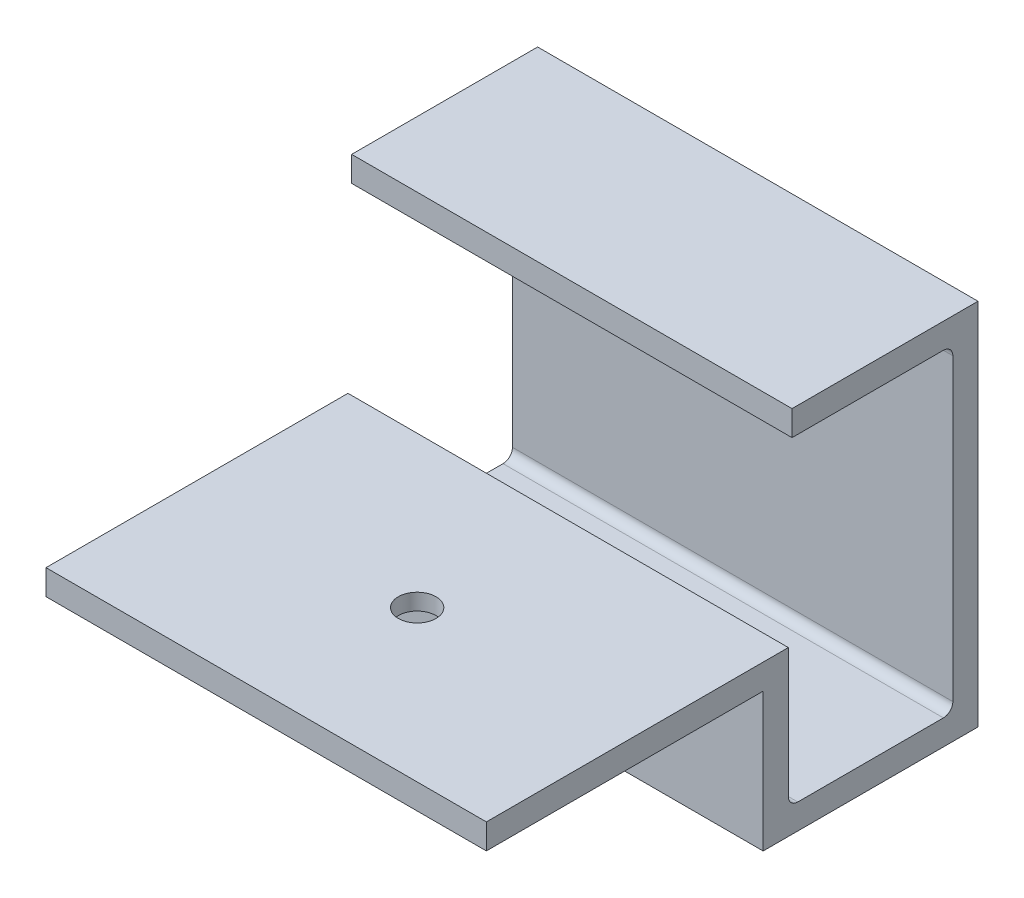
ISO-10303-21;
HEADER;
FILE_DESCRIPTION(('STEP AP214'),'2;1');
FILE_NAME('part.step','',(''),(''),'','','');
FILE_SCHEMA(('AUTOMOTIVE_DESIGN { 1 0 10303 214 1 1 1 1 }'));
ENDSEC;
DATA;
#1=APPLICATION_CONTEXT('core data for automotive mechanical design processes');
#2=APPLICATION_PROTOCOL_DEFINITION('international standard','automotive_design',2000,#1);
#3=PRODUCT_CONTEXT('',#1,'mechanical');
#4=PRODUCT('Part','Part','',(#3));
#5=PRODUCT_RELATED_PRODUCT_CATEGORY('part','',(#4));
#6=PRODUCT_DEFINITION_FORMATION('','',#4);
#7=PRODUCT_DEFINITION_CONTEXT('part definition',#1,'design');
#8=PRODUCT_DEFINITION('design','',#6,#7);
#9=PRODUCT_DEFINITION_SHAPE('','',#8);
#10=(LENGTH_UNIT() NAMED_UNIT(*) SI_UNIT(.MILLI.,.METRE.));
#11=(NAMED_UNIT(*) PLANE_ANGLE_UNIT() SI_UNIT($,.RADIAN.));
#12=(NAMED_UNIT(*) SI_UNIT($,.STERADIAN.) SOLID_ANGLE_UNIT());
#13=UNCERTAINTY_MEASURE_WITH_UNIT(LENGTH_MEASURE(1.E-05),#10,'distance_accuracy_value','');
#14=(GEOMETRIC_REPRESENTATION_CONTEXT(3) GLOBAL_UNCERTAINTY_ASSIGNED_CONTEXT((#13)) GLOBAL_UNIT_ASSIGNED_CONTEXT((#10,
#11,#12)) REPRESENTATION_CONTEXT('',''));
#15=CARTESIAN_POINT('',(0.,0.,0.));
#16=DIRECTION('',(0.,0.,1.));
#17=DIRECTION('',(1.,0.,0.));
#18=AXIS2_PLACEMENT_3D('',#15,#16,#17);
#19=CARTESIAN_POINT('',(70.,0.,-20.));
#20=DIRECTION('',(0.,0.,-1.));
#21=DIRECTION('',(0.,1.,0.));
#22=AXIS2_PLACEMENT_3D('',#19,#20,#21);
#23=PLANE('',#22);
#24=DIRECTION('',(0.,-1.,0.));
#25=VECTOR('',#24,1.);
#26=CARTESIAN_POINT('',(0.,0.,-20.));
#27=LINE('',#26,#25);
#28=CARTESIAN_POINT('',(0.,-2.,-20.));
#29=VERTEX_POINT('',#28);
#30=CARTESIAN_POINT('',(0.,-24.01,-20.));
#31=VERTEX_POINT('',#30);
#32=EDGE_CURVE('E290',#29,#31,#27,.T.);
#33=ORIENTED_EDGE('',*,*,#32,.T.);
#34=DIRECTION('',(-1.,0.,0.));
#35=VECTOR('',#34,1.);
#36=CARTESIAN_POINT('',(70.,-24.01,-20.));
#37=LINE('',#36,#35);
#38=CARTESIAN_POINT('',(70.,-24.01,-20.));
#39=VERTEX_POINT('',#38);
#40=EDGE_CURVE('E196',#39,#31,#37,.T.);
#41=ORIENTED_EDGE('',*,*,#40,.F.);
#42=DIRECTION('',(0.,-1.,0.));
#43=VECTOR('',#42,1.);
#44=CARTESIAN_POINT('',(70.,0.,-20.));
#45=LINE('',#44,#43);
#46=CARTESIAN_POINT('',(70.,-2.,-20.));
#47=VERTEX_POINT('',#46);
#48=EDGE_CURVE('E190',#47,#39,#45,.T.);
#49=ORIENTED_EDGE('',*,*,#48,.F.);
#50=DIRECTION('',(-1.,0.,0.));
#51=VECTOR('',#50,1.);
#52=CARTESIAN_POINT('',(70.,-2.,-20.));
#53=LINE('',#52,#51);
#54=EDGE_CURVE('E194',#47,#29,#53,.T.);
#55=ORIENTED_EDGE('',*,*,#54,.T.);
#56=EDGE_LOOP('',(#33,#41,#49,#55));
#57=FACE_BOUND('',#56,.T.);
#58=ADVANCED_FACE('F82',(#57),#23,.F.);
#59=CARTESIAN_POINT('',(70.,-24.01,0.));
#60=DIRECTION('',(0.,-1.,0.));
#61=DIRECTION('',(0.,0.,-1.));
#62=AXIS2_PLACEMENT_3D('',#59,#60,#61);
#63=PLANE('',#62);
#64=DIRECTION('',(0.,0.,1.));
#65=VECTOR('',#64,1.);
#66=CARTESIAN_POINT('',(0.,-24.01,0.));
#67=LINE('',#66,#65);
#68=CARTESIAN_POINT('',(0.,-24.01,-54.15));
#69=VERTEX_POINT('',#68);
#70=EDGE_CURVE('E292',#69,#31,#67,.T.);
#71=ORIENTED_EDGE('',*,*,#70,.F.);
#72=DIRECTION('',(-1.,0.,0.));
#73=VECTOR('',#72,1.);
#74=CARTESIAN_POINT('',(70.,-24.01,-54.15));
#75=LINE('',#74,#73);
#76=CARTESIAN_POINT('',(70.,-24.01,-54.15));
#77=VERTEX_POINT('',#76);
#78=EDGE_CURVE('E220',#77,#69,#75,.T.);
#79=ORIENTED_EDGE('',*,*,#78,.F.);
#80=DIRECTION('',(0.,0.,1.));
#81=VECTOR('',#80,1.);
#82=CARTESIAN_POINT('',(70.,-24.01,0.));
#83=LINE('',#82,#81);
#84=EDGE_CURVE('E199',#77,#39,#83,.T.);
#85=ORIENTED_EDGE('',*,*,#84,.T.);
#86=ORIENTED_EDGE('',*,*,#40,.T.);
#87=EDGE_LOOP('',(#71,#79,#85,#86));
#88=FACE_BOUND('',#87,.T.);
#89=ADVANCED_FACE('F321',(#88),#63,.T.);
#90=CARTESIAN_POINT('',(70.,0.,-54.15));
#91=DIRECTION('',(0.,0.,1.));
#92=DIRECTION('',(1.,0.,0.));
#93=AXIS2_PLACEMENT_3D('',#90,#91,#92);
#94=PLANE('',#93);
#95=DIRECTION('',(0.,1.,0.));
#96=VECTOR('',#95,1.);
#97=CARTESIAN_POINT('',(0.,0.,-54.15));
#98=LINE('',#97,#96);
#99=CARTESIAN_POINT('',(0.,34.6,-54.15));
#100=VERTEX_POINT('',#99);
#101=EDGE_CURVE('E295',#69,#100,#98,.T.);
#102=ORIENTED_EDGE('',*,*,#101,.T.);
#103=DIRECTION('',(-1.,0.,0.));
#104=VECTOR('',#103,1.);
#105=CARTESIAN_POINT('',(70.,34.6,-54.15));
#106=LINE('',#105,#104);
#107=CARTESIAN_POINT('',(70.,34.6,-54.15));
#108=VERTEX_POINT('',#107);
#109=EDGE_CURVE('E311',#108,#100,#106,.T.);
#110=ORIENTED_EDGE('',*,*,#109,.F.);
#111=DIRECTION('',(0.,1.,0.));
#112=VECTOR('',#111,1.);
#113=CARTESIAN_POINT('',(70.,0.,-54.15));
#114=LINE('',#113,#112);
#115=EDGE_CURVE('E317',#77,#108,#114,.T.);
#116=ORIENTED_EDGE('',*,*,#115,.F.);
#117=ORIENTED_EDGE('',*,*,#78,.T.);
#118=EDGE_LOOP('',(#102,#110,#116,#117));
#119=FACE_BOUND('',#118,.T.);
#120=ADVANCED_FACE('F315',(#119),#94,.F.);
#121=CARTESIAN_POINT('',(70.,34.6,0.));
#122=DIRECTION('',(0.,1.,0.));
#123=DIRECTION('',(0.,0.,1.));
#124=AXIS2_PLACEMENT_3D('',#121,#122,#123);
#125=PLANE('',#124);
#126=DIRECTION('',(0.,0.,-1.));
#127=VECTOR('',#126,1.);
#128=CARTESIAN_POINT('',(0.,34.6,0.));
#129=LINE('',#128,#127);
#130=CARTESIAN_POINT('',(0.,34.6,-24.59));
#131=VERTEX_POINT('',#130);
#132=EDGE_CURVE('E298',#131,#100,#129,.T.);
#133=ORIENTED_EDGE('',*,*,#132,.F.);
#134=DIRECTION('',(-1.,0.,0.));
#135=VECTOR('',#134,1.);
#136=CARTESIAN_POINT('',(70.,34.6,-24.59));
#137=LINE('',#136,#135);
#138=CARTESIAN_POINT('',(70.,34.6,-24.59));
#139=VERTEX_POINT('',#138);
#140=EDGE_CURVE('E236',#139,#131,#137,.T.);
#141=ORIENTED_EDGE('',*,*,#140,.F.);
#142=DIRECTION('',(0.,0.,-1.));
#143=VECTOR('',#142,1.);
#144=CARTESIAN_POINT('',(70.,34.6,0.));
#145=LINE('',#144,#143);
#146=EDGE_CURVE('E374',#139,#108,#145,.T.);
#147=ORIENTED_EDGE('',*,*,#146,.T.);
#148=ORIENTED_EDGE('',*,*,#109,.T.);
#149=EDGE_LOOP('',(#133,#141,#147,#148));
#150=FACE_BOUND('',#149,.T.);
#151=ADVANCED_FACE('F509',(#150),#125,.T.);
#152=CARTESIAN_POINT('',(70.,0.,-50.15));
#153=DIRECTION('',(0.,0.,1.));
#154=DIRECTION('',(1.,0.,0.));
#155=AXIS2_PLACEMENT_3D('',#152,#153,#154);
#156=PLANE('',#155);
#157=DIRECTION('',(0.,1.,0.));
#158=VECTOR('',#157,1.);
#159=CARTESIAN_POINT('',(70.,0.,-50.15));
#160=LINE('',#159,#158);
#161=CARTESIAN_POINT('',(70.,-18.51,-50.15));
#162=VERTEX_POINT('',#161);
#163=CARTESIAN_POINT('',(70.,29.1,-50.15));
#164=VERTEX_POINT('',#163);
#165=EDGE_CURVE('E283',#162,#164,#160,.T.);
#166=ORIENTED_EDGE('',*,*,#165,.T.);
#167=DIRECTION('',(1.,0.,0.));
#168=VECTOR('',#167,1.);
#169=CARTESIAN_POINT('',(0.,29.1,-50.15));
#170=LINE('',#169,#168);
#171=CARTESIAN_POINT('',(0.,29.1,-50.15));
#172=VERTEX_POINT('',#171);
#173=EDGE_CURVE('E242',#164,#172,#170,.F.);
#174=ORIENTED_EDGE('',*,*,#173,.T.);
#175=DIRECTION('',(0.,1.,0.));
#176=VECTOR('',#175,1.);
#177=CARTESIAN_POINT('',(0.,0.,-50.15));
#178=LINE('',#177,#176);
#179=CARTESIAN_POINT('',(0.,-18.51,-50.15));
#180=VERTEX_POINT('',#179);
#181=EDGE_CURVE('E272',#180,#172,#178,.T.);
#182=ORIENTED_EDGE('',*,*,#181,.F.);
#183=DIRECTION('',(-1.,0.,0.));
#184=VECTOR('',#183,1.);
#185=CARTESIAN_POINT('',(70.,-18.51,-50.15));
#186=LINE('',#185,#184);
#187=EDGE_CURVE('E218',#180,#162,#186,.F.);
#188=ORIENTED_EDGE('',*,*,#187,.T.);
#189=EDGE_LOOP('',(#166,#174,#182,#188));
#190=FACE_BOUND('',#189,.T.);
#191=ADVANCED_FACE('F506',(#190),#156,.T.);
#192=CARTESIAN_POINT('',(70.,-20.01,0.));
#193=DIRECTION('',(0.,1.,0.));
#194=DIRECTION('',(0.,0.,1.));
#195=AXIS2_PLACEMENT_3D('',#192,#193,#194);
#196=PLANE('',#195);
#197=DIRECTION('',(0.,0.,-1.));
#198=VECTOR('',#197,1.);
#199=CARTESIAN_POINT('',(70.,-20.01,0.));
#200=LINE('',#199,#198);
#201=CARTESIAN_POINT('',(70.,-20.01,-25.5));
#202=VERTEX_POINT('',#201);
#203=CARTESIAN_POINT('',(70.,-20.01,-48.65));
#204=VERTEX_POINT('',#203);
#205=EDGE_CURVE('E280',#202,#204,#200,.T.);
#206=ORIENTED_EDGE('',*,*,#205,.T.);
#207=DIRECTION('',(-1.,0.,0.));
#208=VECTOR('',#207,1.);
#209=CARTESIAN_POINT('',(0.,-20.01,-48.65));
#210=LINE('',#209,#208);
#211=CARTESIAN_POINT('',(0.,-20.01,-48.65));
#212=VERTEX_POINT('',#211);
#213=EDGE_CURVE('E246',#204,#212,#210,.T.);
#214=ORIENTED_EDGE('',*,*,#213,.T.);
#215=DIRECTION('',(0.,0.,-1.));
#216=VECTOR('',#215,1.);
#217=CARTESIAN_POINT('',(0.,-20.01,0.));
#218=LINE('',#217,#216);
#219=CARTESIAN_POINT('',(0.,-20.01,-25.5));
#220=VERTEX_POINT('',#219);
#221=EDGE_CURVE('E264',#220,#212,#218,.T.);
#222=ORIENTED_EDGE('',*,*,#221,.F.);
#223=DIRECTION('',(-1.,0.,0.));
#224=VECTOR('',#223,1.);
#225=CARTESIAN_POINT('',(70.,-20.01,-25.5));
#226=LINE('',#225,#224);
#227=EDGE_CURVE('E244',#220,#202,#226,.F.);
#228=ORIENTED_EDGE('',*,*,#227,.T.);
#229=EDGE_LOOP('',(#206,#214,#222,#228));
#230=FACE_BOUND('',#229,.T.);
#231=ADVANCED_FACE('F270',(#230),#196,.T.);
#232=CARTESIAN_POINT('',(70.,0.,-24.));
#233=DIRECTION('',(0.,0.,-1.));
#234=DIRECTION('',(-1.,0.,0.));
#235=AXIS2_PLACEMENT_3D('',#232,#233,#234);
#236=PLANE('',#235);
#237=DIRECTION('',(0.,-1.,0.));
#238=VECTOR('',#237,1.);
#239=CARTESIAN_POINT('',(70.,0.,-24.));
#240=LINE('',#239,#238);
#241=CARTESIAN_POINT('',(70.,2.,-24.));
#242=VERTEX_POINT('',#241);
#243=CARTESIAN_POINT('',(70.,-18.51,-24.));
#244=VERTEX_POINT('',#243);
#245=EDGE_CURVE('E276',#242,#244,#240,.T.);
#246=ORIENTED_EDGE('',*,*,#245,.T.);
#247=DIRECTION('',(-1.,0.,0.));
#248=VECTOR('',#247,1.);
#249=CARTESIAN_POINT('',(0.,-18.51,-24.));
#250=LINE('',#249,#248);
#251=CARTESIAN_POINT('',(0.,-18.51,-24.));
#252=VERTEX_POINT('',#251);
#253=EDGE_CURVE('E249',#244,#252,#250,.T.);
#254=ORIENTED_EDGE('',*,*,#253,.T.);
#255=DIRECTION('',(0.,-1.,0.));
#256=VECTOR('',#255,1.);
#257=CARTESIAN_POINT('',(0.,0.,-24.));
#258=LINE('',#257,#256);
#259=CARTESIAN_POINT('',(0.,2.,-24.));
#260=VERTEX_POINT('',#259);
#261=EDGE_CURVE('E267',#260,#252,#258,.T.);
#262=ORIENTED_EDGE('',*,*,#261,.F.);
#263=DIRECTION('',(-1.,0.,0.));
#264=VECTOR('',#263,1.);
#265=CARTESIAN_POINT('',(70.,2.,-24.));
#266=LINE('',#265,#264);
#267=EDGE_CURVE('E277',#242,#260,#266,.T.);
#268=ORIENTED_EDGE('',*,*,#267,.F.);
#269=EDGE_LOOP('',(#246,#254,#262,#268));
#270=FACE_BOUND('',#269,.T.);
#271=ADVANCED_FACE('F275',(#270),#236,.T.);
#272=CARTESIAN_POINT('',(70.,2.,0.));
#273=DIRECTION('',(0.,1.,0.));
#274=DIRECTION('',(0.,0.,1.));
#275=AXIS2_PLACEMENT_3D('',#272,#273,#274);
#276=PLANE('',#275);
#277=CARTESIAN_POINT('',(35.,2.,0.));
#278=DIRECTION('',(0.,1.,0.));
#279=DIRECTION('',(0.,0.,1.));
#280=AXIS2_PLACEMENT_3D('',#277,#278,#279);
#281=CIRCLE('',#280,3.);
#282=CARTESIAN_POINT('',(35.,2.,3.));
#283=VERTEX_POINT('',#282);
#284=EDGE_CURVE('E233',#283,#283,#281,.T.);
#285=ORIENTED_EDGE('',*,*,#284,.F.);
#286=EDGE_LOOP('',(#285));
#287=FACE_BOUND('',#286,.T.);
#288=DIRECTION('',(0.,0.,-1.));
#289=VECTOR('',#288,1.);
#290=CARTESIAN_POINT('',(0.,2.,0.));
#291=LINE('',#290,#289);
#292=CARTESIAN_POINT('',(0.,2.,24.));
#293=VERTEX_POINT('',#292);
#294=EDGE_CURVE('E304',#293,#260,#291,.T.);
#295=ORIENTED_EDGE('',*,*,#294,.F.);
#296=DIRECTION('',(-1.,0.,0.));
#297=VECTOR('',#296,1.);
#298=CARTESIAN_POINT('',(70.,2.,24.));
#299=LINE('',#298,#297);
#300=CARTESIAN_POINT('',(70.,2.,24.));
#301=VERTEX_POINT('',#300);
#302=EDGE_CURVE('E308',#301,#293,#299,.T.);
#303=ORIENTED_EDGE('',*,*,#302,.F.);
#304=DIRECTION('',(0.,0.,-1.));
#305=VECTOR('',#304,1.);
#306=CARTESIAN_POINT('',(70.,2.,0.));
#307=LINE('',#306,#305);
#308=EDGE_CURVE('E279',#301,#242,#307,.T.);
#309=ORIENTED_EDGE('',*,*,#308,.T.);
#310=ORIENTED_EDGE('',*,*,#267,.T.);
#311=EDGE_LOOP('',(#295,#303,#309,#310));
#312=FACE_BOUND('',#311,.T.);
#313=ADVANCED_FACE('F326',(#287,#312),#276,.T.);
#314=CARTESIAN_POINT('',(70.,0.,24.));
#315=DIRECTION('',(0.,0.,-1.));
#316=DIRECTION('',(-1.,0.,0.));
#317=AXIS2_PLACEMENT_3D('',#314,#315,#316);
#318=PLANE('',#317);
#319=DIRECTION('',(0.,-1.,0.));
#320=VECTOR('',#319,1.);
#321=CARTESIAN_POINT('',(0.,0.,24.));
#322=LINE('',#321,#320);
#323=CARTESIAN_POINT('',(0.,-2.,24.));
#324=VERTEX_POINT('',#323);
#325=EDGE_CURVE('E210',#293,#324,#322,.T.);
#326=ORIENTED_EDGE('',*,*,#325,.T.);
#327=DIRECTION('',(-1.,0.,0.));
#328=VECTOR('',#327,1.);
#329=CARTESIAN_POINT('',(70.,-2.,24.));
#330=LINE('',#329,#328);
#331=CARTESIAN_POINT('',(70.,-2.,24.));
#332=VERTEX_POINT('',#331);
#333=EDGE_CURVE('E288',#332,#324,#330,.T.);
#334=ORIENTED_EDGE('',*,*,#333,.F.);
#335=DIRECTION('',(0.,-1.,0.));
#336=VECTOR('',#335,1.);
#337=CARTESIAN_POINT('',(70.,0.,24.));
#338=LINE('',#337,#336);
#339=EDGE_CURVE('E206',#301,#332,#338,.T.);
#340=ORIENTED_EDGE('',*,*,#339,.F.);
#341=ORIENTED_EDGE('',*,*,#302,.T.);
#342=EDGE_LOOP('',(#326,#334,#340,#341));
#343=FACE_BOUND('',#342,.T.);
#344=ADVANCED_FACE('F327',(#343),#318,.F.);
#345=CARTESIAN_POINT('',(70.,-2.,0.));
#346=DIRECTION('',(0.,1.,0.));
#347=DIRECTION('',(0.,0.,1.));
#348=AXIS2_PLACEMENT_3D('',#345,#346,#347);
#349=PLANE('',#348);
#350=CARTESIAN_POINT('',(35.,-2.,0.));
#351=DIRECTION('',(0.,1.,0.));
#352=DIRECTION('',(0.,0.,1.));
#353=AXIS2_PLACEMENT_3D('',#350,#351,#352);
#354=CIRCLE('',#353,5.);
#355=CARTESIAN_POINT('',(35.,-2.,5.));
#356=VERTEX_POINT('',#355);
#357=EDGE_CURVE('E382',#356,#356,#354,.T.);
#358=ORIENTED_EDGE('',*,*,#357,.T.);
#359=EDGE_LOOP('',(#358));
#360=FACE_BOUND('',#359,.T.);
#361=DIRECTION('',(0.,0.,-1.));
#362=VECTOR('',#361,1.);
#363=CARTESIAN_POINT('',(0.,-2.,0.));
#364=LINE('',#363,#362);
#365=EDGE_CURVE('E214',#324,#29,#364,.T.);
#366=ORIENTED_EDGE('',*,*,#365,.T.);
#367=ORIENTED_EDGE('',*,*,#54,.F.);
#368=DIRECTION('',(0.,0.,-1.));
#369=VECTOR('',#368,1.);
#370=CARTESIAN_POINT('',(70.,-2.,0.));
#371=LINE('',#370,#369);
#372=EDGE_CURVE('E200',#332,#47,#371,.T.);
#373=ORIENTED_EDGE('',*,*,#372,.F.);
#374=ORIENTED_EDGE('',*,*,#333,.T.);
#375=EDGE_LOOP('',(#366,#367,#373,#374));
#376=FACE_BOUND('',#375,.T.);
#377=ADVANCED_FACE('F212',(#360,#376),#349,.F.);
#378=CARTESIAN_POINT('',(0.,0.,0.));
#379=DIRECTION('',(1.,0.,0.));
#380=DIRECTION('',(0.,0.,-1.));
#381=AXIS2_PLACEMENT_3D('',#378,#379,#380);
#382=PLANE('',#381);
#383=ORIENTED_EDGE('',*,*,#365,.F.);
#384=ORIENTED_EDGE('',*,*,#325,.F.);
#385=ORIENTED_EDGE('',*,*,#294,.T.);
#386=ORIENTED_EDGE('',*,*,#261,.T.);
#387=CARTESIAN_POINT('',(0.,-18.51,-25.5));
#388=DIRECTION('',(1.,0.,0.));
#389=DIRECTION('',(0.,0.,-1.));
#390=AXIS2_PLACEMENT_3D('',#387,#388,#389);
#391=CIRCLE('',#390,1.5);
#392=EDGE_CURVE('E91',#252,#220,#391,.T.);
#393=ORIENTED_EDGE('',*,*,#392,.T.);
#394=ORIENTED_EDGE('',*,*,#221,.T.);
#395=CARTESIAN_POINT('',(0.,-18.51,-48.65));
#396=DIRECTION('',(1.,0.,0.));
#397=DIRECTION('',(0.,0.,-1.));
#398=AXIS2_PLACEMENT_3D('',#395,#396,#397);
#399=CIRCLE('',#398,1.5);
#400=EDGE_CURVE('E255',#212,#180,#399,.T.);
#401=ORIENTED_EDGE('',*,*,#400,.T.);
#402=ORIENTED_EDGE('',*,*,#181,.T.);
#403=CARTESIAN_POINT('',(0.,29.1,-48.65));
#404=DIRECTION('',(1.,0.,0.));
#405=DIRECTION('',(0.,0.,-1.));
#406=AXIS2_PLACEMENT_3D('',#403,#404,#405);
#407=CIRCLE('',#406,1.5);
#408=CARTESIAN_POINT('',(0.,30.6,-48.65));
#409=VERTEX_POINT('',#408);
#410=EDGE_CURVE('E253',#172,#409,#407,.T.);
#411=ORIENTED_EDGE('',*,*,#410,.T.);
#412=DIRECTION('',(0.,0.,1.));
#413=VECTOR('',#412,1.);
#414=CARTESIAN_POINT('',(0.,30.6,-50.15));
#415=LINE('',#414,#413);
#416=CARTESIAN_POINT('',(0.,30.6,-24.59));
#417=VERTEX_POINT('',#416);
#418=EDGE_CURVE('E231',#409,#417,#415,.T.);
#419=ORIENTED_EDGE('',*,*,#418,.T.);
#420=DIRECTION('',(0.,-1.,0.));
#421=VECTOR('',#420,1.);
#422=CARTESIAN_POINT('',(0.,34.6,-24.59));
#423=LINE('',#422,#421);
#424=EDGE_CURVE('E227',#131,#417,#423,.T.);
#425=ORIENTED_EDGE('',*,*,#424,.F.);
#426=ORIENTED_EDGE('',*,*,#132,.T.);
#427=ORIENTED_EDGE('',*,*,#101,.F.);
#428=ORIENTED_EDGE('',*,*,#70,.T.);
#429=ORIENTED_EDGE('',*,*,#32,.F.);
#430=EDGE_LOOP('',(#383,#384,#385,#386,#393,#394,#401,#402,#411,#419,#425,#426,#427,#428,#429));
#431=FACE_BOUND('',#430,.T.);
#432=ADVANCED_FACE('F263',(#431),#382,.F.);
#433=CARTESIAN_POINT('',(70.,0.,0.));
#434=DIRECTION('',(1.,0.,0.));
#435=DIRECTION('',(0.,0.,-1.));
#436=AXIS2_PLACEMENT_3D('',#433,#434,#435);
#437=PLANE('',#436);
#438=ORIENTED_EDGE('',*,*,#372,.T.);
#439=ORIENTED_EDGE('',*,*,#48,.T.);
#440=ORIENTED_EDGE('',*,*,#84,.F.);
#441=ORIENTED_EDGE('',*,*,#115,.T.);
#442=ORIENTED_EDGE('',*,*,#146,.F.);
#443=DIRECTION('',(0.,-1.,0.));
#444=VECTOR('',#443,1.);
#445=CARTESIAN_POINT('',(70.,34.6,-24.59));
#446=LINE('',#445,#444);
#447=CARTESIAN_POINT('',(70.,30.6,-24.59));
#448=VERTEX_POINT('',#447);
#449=EDGE_CURVE('E226',#139,#448,#446,.T.);
#450=ORIENTED_EDGE('',*,*,#449,.T.);
#451=DIRECTION('',(0.,0.,1.));
#452=VECTOR('',#451,1.);
#453=CARTESIAN_POINT('',(70.,30.6,-50.15));
#454=LINE('',#453,#452);
#455=CARTESIAN_POINT('',(70.,30.6,-48.65));
#456=VERTEX_POINT('',#455);
#457=EDGE_CURVE('E224',#456,#448,#454,.T.);
#458=ORIENTED_EDGE('',*,*,#457,.F.);
#459=CARTESIAN_POINT('',(70.,29.1,-48.65));
#460=DIRECTION('',(1.,0.,0.));
#461=DIRECTION('',(0.,0.,-1.));
#462=AXIS2_PLACEMENT_3D('',#459,#460,#461);
#463=CIRCLE('',#462,1.5);
#464=EDGE_CURVE('E251',#456,#164,#463,.F.);
#465=ORIENTED_EDGE('',*,*,#464,.T.);
#466=ORIENTED_EDGE('',*,*,#165,.F.);
#467=CARTESIAN_POINT('',(70.,-18.51,-48.65));
#468=DIRECTION('',(1.,0.,0.));
#469=DIRECTION('',(0.,0.,-1.));
#470=AXIS2_PLACEMENT_3D('',#467,#468,#469);
#471=CIRCLE('',#470,1.5);
#472=EDGE_CURVE('E257',#162,#204,#471,.F.);
#473=ORIENTED_EDGE('',*,*,#472,.T.);
#474=ORIENTED_EDGE('',*,*,#205,.F.);
#475=CARTESIAN_POINT('',(70.,-18.51,-25.5));
#476=DIRECTION('',(1.,0.,0.));
#477=DIRECTION('',(0.,0.,-1.));
#478=AXIS2_PLACEMENT_3D('',#475,#476,#477);
#479=CIRCLE('',#478,1.5);
#480=EDGE_CURVE('E12',#202,#244,#479,.F.);
#481=ORIENTED_EDGE('',*,*,#480,.T.);
#482=ORIENTED_EDGE('',*,*,#245,.F.);
#483=ORIENTED_EDGE('',*,*,#308,.F.);
#484=ORIENTED_EDGE('',*,*,#339,.T.);
#485=EDGE_LOOP('',(#438,#439,#440,#441,#442,#450,#458,#465,#466,#473,#474,#481,#482,#483,#484));
#486=FACE_BOUND('',#485,.T.);
#487=ADVANCED_FACE('F203',(#486),#437,.T.);
#488=CARTESIAN_POINT('',(70.,34.6,-24.59));
#489=DIRECTION('',(0.,0.,-1.));
#490=DIRECTION('',(-1.,0.,0.));
#491=AXIS2_PLACEMENT_3D('',#488,#489,#490);
#492=PLANE('',#491);
#493=ORIENTED_EDGE('',*,*,#424,.T.);
#494=DIRECTION('',(-1.,0.,0.));
#495=VECTOR('',#494,1.);
#496=CARTESIAN_POINT('',(70.,30.6,-24.59));
#497=LINE('',#496,#495);
#498=EDGE_CURVE('E230',#448,#417,#497,.T.);
#499=ORIENTED_EDGE('',*,*,#498,.F.);
#500=ORIENTED_EDGE('',*,*,#449,.F.);
#501=ORIENTED_EDGE('',*,*,#140,.T.);
#502=EDGE_LOOP('',(#493,#499,#500,#501));
#503=FACE_BOUND('',#502,.T.);
#504=ADVANCED_FACE('F349',(#503),#492,.F.);
#505=CARTESIAN_POINT('',(70.,30.6,-50.15));
#506=DIRECTION('',(0.,-1.,0.));
#507=DIRECTION('',(0.,0.,-1.));
#508=AXIS2_PLACEMENT_3D('',#505,#506,#507);
#509=PLANE('',#508);
#510=ORIENTED_EDGE('',*,*,#418,.F.);
#511=DIRECTION('',(1.,0.,0.));
#512=VECTOR('',#511,1.);
#513=CARTESIAN_POINT('',(70.,30.6,-48.65));
#514=LINE('',#513,#512);
#515=EDGE_CURVE('E215',#409,#456,#514,.T.);
#516=ORIENTED_EDGE('',*,*,#515,.T.);
#517=ORIENTED_EDGE('',*,*,#457,.T.);
#518=ORIENTED_EDGE('',*,*,#498,.T.);
#519=EDGE_LOOP('',(#510,#516,#517,#518));
#520=FACE_BOUND('',#519,.T.);
#521=ADVANCED_FACE('F352',(#520),#509,.T.);
#522=CARTESIAN_POINT('',(70.,29.1,-48.65));
#523=DIRECTION('',(-1.,0.,0.));
#524=DIRECTION('',(0.,0.,1.));
#525=AXIS2_PLACEMENT_3D('',#522,#523,#524);
#526=CYLINDRICAL_SURFACE('',#525,1.5);
#527=ORIENTED_EDGE('',*,*,#410,.F.);
#528=ORIENTED_EDGE('',*,*,#173,.F.);
#529=ORIENTED_EDGE('',*,*,#464,.F.);
#530=ORIENTED_EDGE('',*,*,#515,.F.);
#531=EDGE_LOOP('',(#527,#528,#529,#530));
#532=FACE_BOUND('',#531,.T.);
#533=ADVANCED_FACE('F354',(#532),#526,.F.);
#534=CARTESIAN_POINT('',(70.,-18.51,-48.65));
#535=DIRECTION('',(1.,0.,0.));
#536=DIRECTION('',(0.,0.,-1.));
#537=AXIS2_PLACEMENT_3D('',#534,#535,#536);
#538=CYLINDRICAL_SURFACE('',#537,1.5);
#539=ORIENTED_EDGE('',*,*,#472,.F.);
#540=ORIENTED_EDGE('',*,*,#187,.F.);
#541=ORIENTED_EDGE('',*,*,#400,.F.);
#542=ORIENTED_EDGE('',*,*,#213,.F.);
#543=EDGE_LOOP('',(#539,#540,#541,#542));
#544=FACE_BOUND('',#543,.T.);
#545=ADVANCED_FACE('F359',(#544),#538,.F.);
#546=CARTESIAN_POINT('',(70.,-18.51,-25.5));
#547=DIRECTION('',(1.,0.,0.));
#548=DIRECTION('',(0.,0.,-1.));
#549=AXIS2_PLACEMENT_3D('',#546,#547,#548);
#550=CYLINDRICAL_SURFACE('',#549,1.5);
#551=ORIENTED_EDGE('',*,*,#480,.F.);
#552=ORIENTED_EDGE('',*,*,#227,.F.);
#553=ORIENTED_EDGE('',*,*,#392,.F.);
#554=ORIENTED_EDGE('',*,*,#253,.F.);
#555=EDGE_LOOP('',(#551,#552,#553,#554));
#556=FACE_BOUND('',#555,.T.);
#557=ADVANCED_FACE('F84',(#556),#550,.F.);
#558=CARTESIAN_POINT('',(35.,-24.01,0.));
#559=DIRECTION('',(0.,1.,0.));
#560=DIRECTION('',(0.,0.,1.));
#561=AXIS2_PLACEMENT_3D('',#558,#559,#560);
#562=CYLINDRICAL_SURFACE('',#561,3.);
#563=CARTESIAN_POINT('',(35.,-0.6,0.));
#564=DIRECTION('',(0.,1.,0.));
#565=DIRECTION('',(0.,0.,1.));
#566=AXIS2_PLACEMENT_3D('',#563,#564,#565);
#567=CIRCLE('',#566,3.);
#568=CARTESIAN_POINT('',(35.,-0.6,3.));
#569=VERTEX_POINT('',#568);
#570=EDGE_CURVE('E86',#569,#569,#567,.F.);
#571=ORIENTED_EDGE('',*,*,#570,.T.);
#572=EDGE_LOOP('',(#571));
#573=FACE_BOUND('',#572,.T.);
#574=ORIENTED_EDGE('',*,*,#284,.T.);
#575=EDGE_LOOP('',(#574));
#576=FACE_BOUND('',#575,.T.);
#577=ADVANCED_FACE('F366',(#573,#576),#562,.F.);
#578=CARTESIAN_POINT('',(35.,-0.599999999999999,0.));
#579=DIRECTION('',(0.,1.,0.));
#580=DIRECTION('',(0.,0.,1.));
#581=AXIS2_PLACEMENT_3D('',#578,#579,#580);
#582=PLANE('',#581);
#583=CARTESIAN_POINT('',(35.,-0.599999999999999,0.));
#584=DIRECTION('',(0.,1.,0.));
#585=DIRECTION('',(0.,0.,1.));
#586=AXIS2_PLACEMENT_3D('',#583,#584,#585);
#587=CIRCLE('',#586,5.);
#588=CARTESIAN_POINT('',(35.,-0.599999999999999,5.));
#589=VERTEX_POINT('',#588);
#590=EDGE_CURVE('E385',#589,#589,#587,.T.);
#591=ORIENTED_EDGE('',*,*,#590,.F.);
#592=EDGE_LOOP('',(#591));
#593=FACE_BOUND('',#592,.T.);
#594=ORIENTED_EDGE('',*,*,#570,.F.);
#595=EDGE_LOOP('',(#594));
#596=FACE_BOUND('',#595,.T.);
#597=ADVANCED_FACE('F394',(#593,#596),#582,.F.);
#598=CARTESIAN_POINT('',(35.,-0.599999999999999,0.));
#599=DIRECTION('',(0.,-1.,0.));
#600=DIRECTION('',(0.,0.,-1.));
#601=AXIS2_PLACEMENT_3D('',#598,#599,#600);
#602=CYLINDRICAL_SURFACE('',#601,5.);
#603=ORIENTED_EDGE('',*,*,#590,.T.);
#604=EDGE_LOOP('',(#603));
#605=FACE_BOUND('',#604,.T.);
#606=ORIENTED_EDGE('',*,*,#357,.F.);
#607=EDGE_LOOP('',(#606));
#608=FACE_BOUND('',#607,.T.);
#609=ADVANCED_FACE('F396',(#605,#608),#602,.F.);
#610=CLOSED_SHELL('',(#58,#89,#120,#151,#191,#231,#271,#313,#344,#377,#432,#487,#504,#521,#533,
#545,#557,#577,#597,#609));
#611=MANIFOLD_SOLID_BREP('B2',#610);
#612=ADVANCED_BREP_SHAPE_REPRESENTATION('',(#18,#611),#14);
#613=SHAPE_DEFINITION_REPRESENTATION(#9,#612);
ENDSEC;
END-ISO-10303-21;
